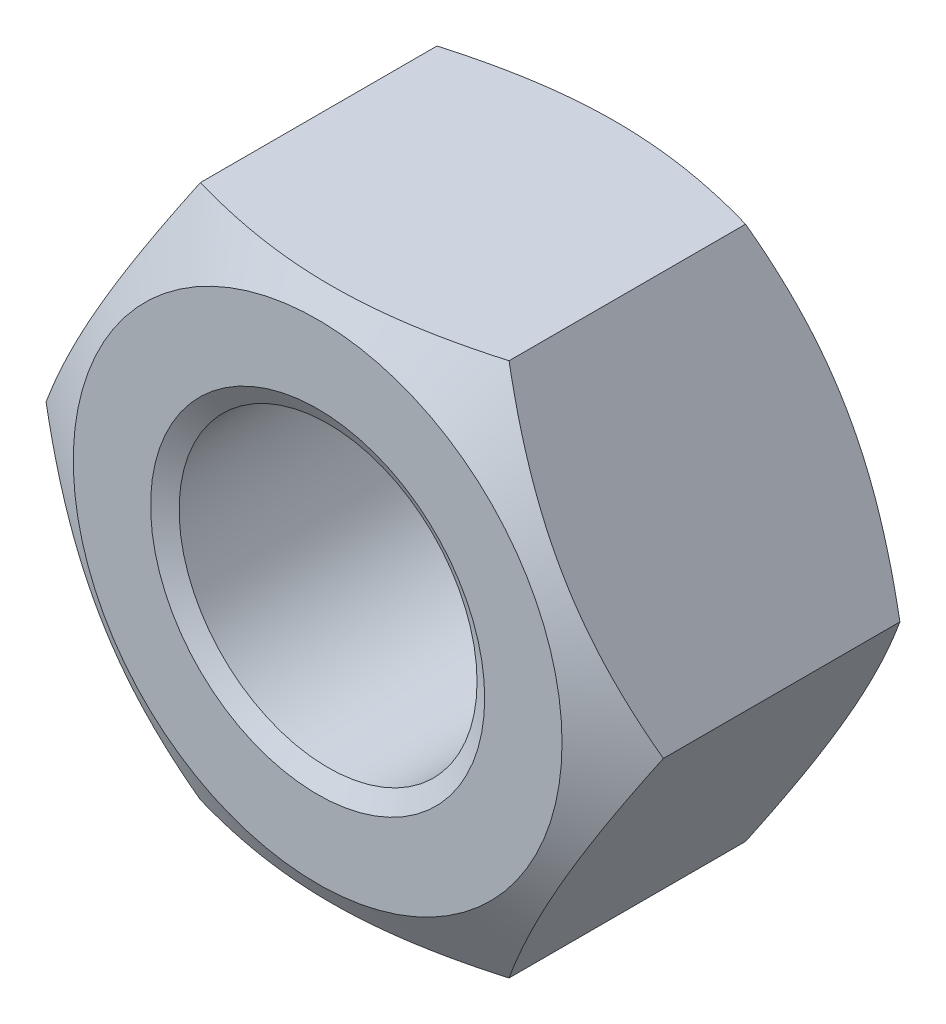
ISO-10303-21;
HEADER;
FILE_DESCRIPTION(('STEP AP214'),'2;1');
FILE_NAME('part.step','',(''),(''),'','','');
FILE_SCHEMA(('AUTOMOTIVE_DESIGN { 1 0 10303 214 1 1 1 1 }'));
ENDSEC;
DATA;
#1=APPLICATION_CONTEXT('core data for automotive mechanical design processes');
#2=APPLICATION_PROTOCOL_DEFINITION('international standard','automotive_design',2000,#1);
#3=PRODUCT_CONTEXT('',#1,'mechanical');
#4=PRODUCT('Part','Part','',(#3));
#5=PRODUCT_RELATED_PRODUCT_CATEGORY('part','',(#4));
#6=PRODUCT_DEFINITION_FORMATION('','',#4);
#7=PRODUCT_DEFINITION_CONTEXT('part definition',#1,'design');
#8=PRODUCT_DEFINITION('design','',#6,#7);
#9=PRODUCT_DEFINITION_SHAPE('','',#8);
#10=(LENGTH_UNIT() NAMED_UNIT(*) SI_UNIT(.MILLI.,.METRE.));
#11=(NAMED_UNIT(*) PLANE_ANGLE_UNIT() SI_UNIT($,.RADIAN.));
#12=(NAMED_UNIT(*) SI_UNIT($,.STERADIAN.) SOLID_ANGLE_UNIT());
#13=UNCERTAINTY_MEASURE_WITH_UNIT(LENGTH_MEASURE(1.E-05),#10,'distance_accuracy_value','');
#14=(GEOMETRIC_REPRESENTATION_CONTEXT(3) GLOBAL_UNCERTAINTY_ASSIGNED_CONTEXT((#13)) GLOBAL_UNIT_ASSIGNED_CONTEXT((#10,
#11,#12)) REPRESENTATION_CONTEXT('',''));
#15=CARTESIAN_POINT('',(0.,0.,0.));
#16=DIRECTION('',(0.,0.,1.));
#17=DIRECTION('',(1.,0.,0.));
#18=AXIS2_PLACEMENT_3D('',#15,#16,#17);
#19=CARTESIAN_POINT('',(-6.92820323027551,-4.,0.));
#20=DIRECTION('',(-0.866025403784439,-0.5,0.));
#21=DIRECTION('',(0.5,-0.866025403784439,0.));
#22=AXIS2_PLACEMENT_3D('',#19,#20,#21);
#23=PLANE('',#22);
#24=CARTESIAN_POINT('',(-9.23760430703401,0.,8.18998388578878));
#25=CARTESIAN_POINT('',(-6.92820323027554,-4.00000000000001,9.52331721912213));
#26=CARTESIAN_POINT('',(-4.61880215351701,-8.,8.18998388578878));
#27=(BOUNDED_CURVE() B_SPLINE_CURVE(2,(#24,#25,#26),.UNSPECIFIED.,.F.,
.F.) B_SPLINE_CURVE_WITH_KNOTS((3,3),(0.,9.34748910462335),
.UNSPECIFIED.) CURVE() GEOMETRIC_REPRESENTATION_ITEM() RATIONAL_B_SPLINE_CURVE((1.,
1.15470053837925,1.)) REPRESENTATION_ITEM(''));
#28=CARTESIAN_POINT('',(-9.23760430703401,0.,8.18998388578878));
#29=VERTEX_POINT('',#28);
#30=CARTESIAN_POINT('',(-4.61880215351701,-8.,8.18998388578878));
#31=VERTEX_POINT('',#30);
#32=EDGE_CURVE('E149',#29,#31,#27,.T.);
#33=ORIENTED_EDGE('',*,*,#32,.F.);
#34=DIRECTION('',(0.,0.,1.));
#35=VECTOR('',#34,1.);
#36=CARTESIAN_POINT('',(-9.23760430703401,0.,0.));
#37=LINE('',#36,#35);
#38=CARTESIAN_POINT('',(-9.23760430703401,0.,1.11001611421122));
#39=VERTEX_POINT('',#38);
#40=EDGE_CURVE('E168',#39,#29,#37,.T.);
#41=ORIENTED_EDGE('',*,*,#40,.F.);
#42=CARTESIAN_POINT('',(-4.61880215351701,-8.,1.11001611421122));
#43=CARTESIAN_POINT('',(-6.92820323027552,-4.,-0.223317219122113));
#44=CARTESIAN_POINT('',(-9.23760430703401,0.,1.11001611421122));
#45=(BOUNDED_CURVE() B_SPLINE_CURVE(2,(#42,#43,#44),.UNSPECIFIED.,.F.,
.F.) B_SPLINE_CURVE_WITH_KNOTS((3,3),(0.,9.34748910462335),
.UNSPECIFIED.) CURVE() GEOMETRIC_REPRESENTATION_ITEM() RATIONAL_B_SPLINE_CURVE((1.,
1.15470053837925,1.)) REPRESENTATION_ITEM(''));
#46=CARTESIAN_POINT('',(-4.61880215351701,-8.,1.11001611421122));
#47=VERTEX_POINT('',#46);
#48=EDGE_CURVE('E110',#47,#39,#45,.T.);
#49=ORIENTED_EDGE('',*,*,#48,.F.);
#50=DIRECTION('',(0.,0.,1.));
#51=VECTOR('',#50,1.);
#52=CARTESIAN_POINT('',(-4.61880215351701,-8.,0.));
#53=LINE('',#52,#51);
#54=EDGE_CURVE('E11',#47,#31,#53,.T.);
#55=ORIENTED_EDGE('',*,*,#54,.T.);
#56=EDGE_LOOP('',(#33,#41,#49,#55));
#57=FACE_BOUND('',#56,.T.);
#58=ADVANCED_FACE('F16',(#57),#23,.T.);
#59=CARTESIAN_POINT('',(0.,-8.,0.));
#60=DIRECTION('',(0.,-1.,0.));
#61=DIRECTION('',(1.,0.,0.));
#62=AXIS2_PLACEMENT_3D('',#59,#60,#61);
#63=PLANE('',#62);
#64=CARTESIAN_POINT('',(-4.61880215351701,-8.,8.18998388578878));
#65=CARTESIAN_POINT('',(0.,-7.99999999999999,9.52331721912211));
#66=CARTESIAN_POINT('',(4.61880215351701,-8.,8.18998388578878));
#67=(BOUNDED_CURVE() B_SPLINE_CURVE(2,(#64,#65,#66),.UNSPECIFIED.,.F.,
.F.) B_SPLINE_CURVE_WITH_KNOTS((3,3),(0.,9.34748910462335),
.UNSPECIFIED.) CURVE() GEOMETRIC_REPRESENTATION_ITEM() RATIONAL_B_SPLINE_CURVE((1.,
1.15470053837925,1.)) REPRESENTATION_ITEM(''));
#68=CARTESIAN_POINT('',(4.618802153517,-8.,8.18998388578878));
#69=VERTEX_POINT('',#68);
#70=EDGE_CURVE('E157',#31,#69,#67,.T.);
#71=ORIENTED_EDGE('',*,*,#70,.F.);
#72=ORIENTED_EDGE('',*,*,#54,.F.);
#73=CARTESIAN_POINT('',(4.61880215351701,-8.,1.11001611421122));
#74=CARTESIAN_POINT('',(0.,-8.,-0.223317219122115));
#75=CARTESIAN_POINT('',(-4.61880215351701,-8.,1.11001611421122));
#76=(BOUNDED_CURVE() B_SPLINE_CURVE(2,(#73,#74,#75),.UNSPECIFIED.,.F.,
.F.) B_SPLINE_CURVE_WITH_KNOTS((3,3),(0.,9.34748910462335),
.UNSPECIFIED.) CURVE() GEOMETRIC_REPRESENTATION_ITEM() RATIONAL_B_SPLINE_CURVE((1.,
1.15470053837925,1.)) REPRESENTATION_ITEM(''));
#77=CARTESIAN_POINT('',(4.618802153517,-8.,1.11001611421122));
#78=VERTEX_POINT('',#77);
#79=EDGE_CURVE('E105',#78,#47,#76,.T.);
#80=ORIENTED_EDGE('',*,*,#79,.F.);
#81=DIRECTION('',(0.,0.,1.));
#82=VECTOR('',#81,1.);
#83=CARTESIAN_POINT('',(4.61880215351701,-8.,0.));
#84=LINE('',#83,#82);
#85=EDGE_CURVE('E26',#78,#69,#84,.T.);
#86=ORIENTED_EDGE('',*,*,#85,.T.);
#87=EDGE_LOOP('',(#71,#72,#80,#86));
#88=FACE_BOUND('',#87,.T.);
#89=ADVANCED_FACE('F106',(#88),#63,.T.);
#90=CARTESIAN_POINT('',(0.,0.,9.3));
#91=DIRECTION('',(0.,0.,1.));
#92=DIRECTION('',(0.,-1.,0.));
#93=AXIS2_PLACEMENT_3D('',#90,#91,#92);
#94=PLANE('',#93);
#95=CARTESIAN_POINT('',(0.,0.,9.3));
#96=DIRECTION('',(0.,0.,-1.));
#97=DIRECTION('',(1.,0.,0.));
#98=AXIS2_PLACEMENT_3D('',#95,#96,#97);
#99=CIRCLE('',#98,7.315);
#100=CARTESIAN_POINT('',(7.315,0.,9.3));
#101=VERTEX_POINT('',#100);
#102=EDGE_CURVE('E33',#101,#101,#99,.T.);
#103=ORIENTED_EDGE('',*,*,#102,.F.);
#104=EDGE_LOOP('',(#103));
#105=FACE_BOUND('',#104,.T.);
#106=CARTESIAN_POINT('',(0.,0.,9.3));
#107=DIRECTION('',(0.,0.,-1.));
#108=DIRECTION('',(1.,0.,0.));
#109=AXIS2_PLACEMENT_3D('',#106,#107,#108);
#110=CIRCLE('',#109,5.);
#111=CARTESIAN_POINT('',(5.,0.,9.3));
#112=VERTEX_POINT('',#111);
#113=EDGE_CURVE('E20',#112,#112,#110,.T.);
#114=ORIENTED_EDGE('',*,*,#113,.T.);
#115=EDGE_LOOP('',(#114));
#116=FACE_BOUND('',#115,.T.);
#117=ADVANCED_FACE('F209',(#105,#116),#94,.T.);
#118=CARTESIAN_POINT('',(0.,0.,0.));
#119=DIRECTION('',(0.,0.,1.));
#120=DIRECTION('',(0.,-1.,0.));
#121=AXIS2_PLACEMENT_3D('',#118,#119,#120);
#122=PLANE('',#121);
#123=CARTESIAN_POINT('',(0.,0.,0.));
#124=DIRECTION('',(0.,0.,1.));
#125=DIRECTION('',(1.,0.,0.));
#126=AXIS2_PLACEMENT_3D('',#123,#124,#125);
#127=CIRCLE('',#126,7.315);
#128=CARTESIAN_POINT('',(7.315,0.,0.));
#129=VERTEX_POINT('',#128);
#130=EDGE_CURVE('E132',#129,#129,#127,.T.);
#131=ORIENTED_EDGE('',*,*,#130,.F.);
#132=EDGE_LOOP('',(#131));
#133=FACE_BOUND('',#132,.T.);
#134=CARTESIAN_POINT('',(0.,0.,0.));
#135=DIRECTION('',(0.,0.,1.));
#136=DIRECTION('',(1.,0.,0.));
#137=AXIS2_PLACEMENT_3D('',#134,#135,#136);
#138=CIRCLE('',#137,5.);
#139=CARTESIAN_POINT('',(5.,0.,0.));
#140=VERTEX_POINT('',#139);
#141=EDGE_CURVE('E127',#140,#140,#138,.T.);
#142=ORIENTED_EDGE('',*,*,#141,.T.);
#143=EDGE_LOOP('',(#142));
#144=FACE_BOUND('',#143,.T.);
#145=ADVANCED_FACE('F206',(#133,#144),#122,.F.);
#146=CARTESIAN_POINT('',(6.92820323027551,-4.,0.));
#147=DIRECTION('',(0.866025403784439,-0.5,0.));
#148=DIRECTION('',(0.5,0.866025403784439,0.));
#149=AXIS2_PLACEMENT_3D('',#146,#147,#148);
#150=PLANE('',#149);
#151=CARTESIAN_POINT('',(4.618802153517,-8.,8.18998388578878));
#152=CARTESIAN_POINT('',(6.92820323027549,-3.99999999999999,9.52331721912211));
#153=CARTESIAN_POINT('',(9.23760430703401,0.,8.18998388578878));
#154=(BOUNDED_CURVE() B_SPLINE_CURVE(2,(#151,#152,#153),.UNSPECIFIED.,.F.,
.F.) B_SPLINE_CURVE_WITH_KNOTS((3,3),(0.,9.34748910462335),
.UNSPECIFIED.) CURVE() GEOMETRIC_REPRESENTATION_ITEM() RATIONAL_B_SPLINE_CURVE((1.,
1.15470053837925,1.)) REPRESENTATION_ITEM(''));
#155=CARTESIAN_POINT('',(9.23760430703401,0.,8.18998388578878));
#156=VERTEX_POINT('',#155);
#157=EDGE_CURVE('E99',#69,#156,#154,.T.);
#158=ORIENTED_EDGE('',*,*,#157,.F.);
#159=ORIENTED_EDGE('',*,*,#85,.F.);
#160=CARTESIAN_POINT('',(9.23760430703401,0.,1.11001611421122));
#161=CARTESIAN_POINT('',(6.92820323027551,-4.,-0.223317219122115));
#162=CARTESIAN_POINT('',(4.618802153517,-8.,1.11001611421122));
#163=(BOUNDED_CURVE() B_SPLINE_CURVE(2,(#160,#161,#162),.UNSPECIFIED.,.F.,
.F.) B_SPLINE_CURVE_WITH_KNOTS((3,3),(0.,9.34748910462335),
.UNSPECIFIED.) CURVE() GEOMETRIC_REPRESENTATION_ITEM() RATIONAL_B_SPLINE_CURVE((1.,
1.15470053837925,1.)) REPRESENTATION_ITEM(''));
#164=CARTESIAN_POINT('',(9.23760430703401,0.,1.11001611421122));
#165=VERTEX_POINT('',#164);
#166=EDGE_CURVE('E97',#165,#78,#163,.T.);
#167=ORIENTED_EDGE('',*,*,#166,.F.);
#168=DIRECTION('',(0.,0.,1.));
#169=VECTOR('',#168,1.);
#170=CARTESIAN_POINT('',(9.23760430703401,0.,0.));
#171=LINE('',#170,#169);
#172=EDGE_CURVE('E53',#165,#156,#171,.T.);
#173=ORIENTED_EDGE('',*,*,#172,.T.);
#174=EDGE_LOOP('',(#158,#159,#167,#173));
#175=FACE_BOUND('',#174,.T.);
#176=ADVANCED_FACE('F95',(#175),#150,.T.);
#177=CARTESIAN_POINT('',(6.92820323027551,4.,0.));
#178=DIRECTION('',(0.866025403784439,0.5,0.));
#179=DIRECTION('',(-0.5,0.866025403784439,0.));
#180=AXIS2_PLACEMENT_3D('',#177,#178,#179);
#181=PLANE('',#180);
#182=CARTESIAN_POINT('',(9.23760430703401,0.,8.18998388578878));
#183=CARTESIAN_POINT('',(6.92820323027549,3.99999999999999,9.52331721912211));
#184=CARTESIAN_POINT('',(4.61880215351701,8.,8.18998388578878));
#185=(BOUNDED_CURVE() B_SPLINE_CURVE(2,(#182,#183,#184),.UNSPECIFIED.,.F.,
.F.) B_SPLINE_CURVE_WITH_KNOTS((3,3),(0.,9.34748910462335),
.UNSPECIFIED.) CURVE() GEOMETRIC_REPRESENTATION_ITEM() RATIONAL_B_SPLINE_CURVE((1.,
1.15470053837925,1.)) REPRESENTATION_ITEM(''));
#186=CARTESIAN_POINT('',(4.61880215351701,8.,8.18998388578878));
#187=VERTEX_POINT('',#186);
#188=EDGE_CURVE('E131',#156,#187,#185,.T.);
#189=ORIENTED_EDGE('',*,*,#188,.F.);
#190=ORIENTED_EDGE('',*,*,#172,.F.);
#191=CARTESIAN_POINT('',(4.61880215351701,8.,1.11001611421122));
#192=CARTESIAN_POINT('',(6.92820323027551,3.99999999999999,-0.223317219122115));
#193=CARTESIAN_POINT('',(9.23760430703401,0.,1.11001611421122));
#194=(BOUNDED_CURVE() B_SPLINE_CURVE(2,(#191,#192,#193),.UNSPECIFIED.,.F.,
.F.) B_SPLINE_CURVE_WITH_KNOTS((3,3),(0.,9.34748910462335),
.UNSPECIFIED.) CURVE() GEOMETRIC_REPRESENTATION_ITEM() RATIONAL_B_SPLINE_CURVE((1.,
1.15470053837925,1.)) REPRESENTATION_ITEM(''));
#195=CARTESIAN_POINT('',(4.61880215351701,8.,1.11001611421122));
#196=VERTEX_POINT('',#195);
#197=EDGE_CURVE('E114',#196,#165,#194,.T.);
#198=ORIENTED_EDGE('',*,*,#197,.F.);
#199=DIRECTION('',(0.,0.,1.));
#200=VECTOR('',#199,1.);
#201=CARTESIAN_POINT('',(4.61880215351701,8.,0.));
#202=LINE('',#201,#200);
#203=EDGE_CURVE('E60',#196,#187,#202,.T.);
#204=ORIENTED_EDGE('',*,*,#203,.T.);
#205=EDGE_LOOP('',(#189,#190,#198,#204));
#206=FACE_BOUND('',#205,.T.);
#207=ADVANCED_FACE('F241',(#206),#181,.T.);
#208=CARTESIAN_POINT('',(0.,8.,0.));
#209=DIRECTION('',(0.,1.,0.));
#210=DIRECTION('',(-1.,0.,0.));
#211=AXIS2_PLACEMENT_3D('',#208,#209,#210);
#212=PLANE('',#211);
#213=CARTESIAN_POINT('',(4.61880215351701,8.,8.18998388578878));
#214=CARTESIAN_POINT('',(0.,8.,9.52331721912211));
#215=CARTESIAN_POINT('',(-4.61880215351701,8.,8.18998388578878));
#216=(BOUNDED_CURVE() B_SPLINE_CURVE(2,(#213,#214,#215),.UNSPECIFIED.,.F.,
.F.) B_SPLINE_CURVE_WITH_KNOTS((3,3),(0.,9.34748910462335),
.UNSPECIFIED.) CURVE() GEOMETRIC_REPRESENTATION_ITEM() RATIONAL_B_SPLINE_CURVE((1.,
1.15470053837925,1.)) REPRESENTATION_ITEM(''));
#217=CARTESIAN_POINT('',(-4.618802153517,8.,8.18998388578878));
#218=VERTEX_POINT('',#217);
#219=EDGE_CURVE('E140',#187,#218,#216,.T.);
#220=ORIENTED_EDGE('',*,*,#219,.F.);
#221=ORIENTED_EDGE('',*,*,#203,.F.);
#222=CARTESIAN_POINT('',(-4.61880215351701,8.,1.11001611421122));
#223=CARTESIAN_POINT('',(0.,8.,-0.223317219122115));
#224=CARTESIAN_POINT('',(4.61880215351701,8.,1.11001611421122));
#225=(BOUNDED_CURVE() B_SPLINE_CURVE(2,(#222,#223,#224),.UNSPECIFIED.,.F.,
.F.) B_SPLINE_CURVE_WITH_KNOTS((3,3),(0.,9.34748910462335),
.UNSPECIFIED.) CURVE() GEOMETRIC_REPRESENTATION_ITEM() RATIONAL_B_SPLINE_CURVE((1.,
1.15470053837925,1.)) REPRESENTATION_ITEM(''));
#226=CARTESIAN_POINT('',(-4.618802153517,8.,1.11001611421122));
#227=VERTEX_POINT('',#226);
#228=EDGE_CURVE('E183',#227,#196,#225,.T.);
#229=ORIENTED_EDGE('',*,*,#228,.F.);
#230=DIRECTION('',(0.,0.,1.));
#231=VECTOR('',#230,1.);
#232=CARTESIAN_POINT('',(-4.618802153517,8.,0.));
#233=LINE('',#232,#231);
#234=EDGE_CURVE('E120',#227,#218,#233,.T.);
#235=ORIENTED_EDGE('',*,*,#234,.T.);
#236=EDGE_LOOP('',(#220,#221,#229,#235));
#237=FACE_BOUND('',#236,.T.);
#238=ADVANCED_FACE('F18',(#237),#212,.T.);
#239=CARTESIAN_POINT('',(-6.92820323027551,4.,0.));
#240=DIRECTION('',(-0.866025403784439,0.5,0.));
#241=DIRECTION('',(-0.5,-0.866025403784439,0.));
#242=AXIS2_PLACEMENT_3D('',#239,#240,#241);
#243=PLANE('',#242);
#244=CARTESIAN_POINT('',(-4.618802153517,8.,8.18998388578878));
#245=CARTESIAN_POINT('',(-6.92820323027552,4.,9.52331721912213));
#246=CARTESIAN_POINT('',(-9.23760430703401,0.,8.18998388578878));
#247=(BOUNDED_CURVE() B_SPLINE_CURVE(2,(#244,#245,#246),.UNSPECIFIED.,.F.,
.F.) B_SPLINE_CURVE_WITH_KNOTS((3,3),(0.,9.34748910462335),
.UNSPECIFIED.) CURVE() GEOMETRIC_REPRESENTATION_ITEM() RATIONAL_B_SPLINE_CURVE((1.,
1.15470053837925,1.)) REPRESENTATION_ITEM(''));
#248=EDGE_CURVE('E148',#218,#29,#247,.T.);
#249=ORIENTED_EDGE('',*,*,#248,.F.);
#250=ORIENTED_EDGE('',*,*,#234,.F.);
#251=CARTESIAN_POINT('',(-9.23760430703401,0.,1.11001611421122));
#252=CARTESIAN_POINT('',(-6.92820323027554,4.00000000000001,-0.223317219122116));
#253=CARTESIAN_POINT('',(-4.618802153517,8.,1.11001611421122));
#254=(BOUNDED_CURVE() B_SPLINE_CURVE(2,(#251,#252,#253),.UNSPECIFIED.,.F.,
.F.) B_SPLINE_CURVE_WITH_KNOTS((3,3),(0.,9.34748910462335),
.UNSPECIFIED.) CURVE() GEOMETRIC_REPRESENTATION_ITEM() RATIONAL_B_SPLINE_CURVE((1.,
1.15470053837925,1.)) REPRESENTATION_ITEM(''));
#255=EDGE_CURVE('E178',#39,#227,#254,.T.);
#256=ORIENTED_EDGE('',*,*,#255,.F.);
#257=ORIENTED_EDGE('',*,*,#40,.T.);
#258=EDGE_LOOP('',(#249,#250,#256,#257));
#259=FACE_BOUND('',#258,.T.);
#260=ADVANCED_FACE('F242',(#259),#243,.T.);
#261=CARTESIAN_POINT('',(0.,0.,8.74499194289439));
#262=DIRECTION('',(0.,0.,-1.));
#263=DIRECTION('',(1.,0.,0.));
#264=AXIS2_PLACEMENT_3D('',#261,#262,#263);
#265=CONICAL_SURFACE('',#264,8.27630215351701,1.0471975511966);
#266=ORIENTED_EDGE('',*,*,#102,.T.);
#267=EDGE_LOOP('',(#266));
#268=FACE_BOUND('',#267,.T.);
#269=ORIENTED_EDGE('',*,*,#157,.T.);
#270=ORIENTED_EDGE('',*,*,#188,.T.);
#271=ORIENTED_EDGE('',*,*,#219,.T.);
#272=ORIENTED_EDGE('',*,*,#248,.T.);
#273=ORIENTED_EDGE('',*,*,#32,.T.);
#274=ORIENTED_EDGE('',*,*,#70,.T.);
#275=EDGE_LOOP('',(#269,#270,#271,#272,#273,#274));
#276=FACE_BOUND('',#275,.T.);
#277=ADVANCED_FACE('F245',(#268,#276),#265,.T.);
#278=CARTESIAN_POINT('',(0.,0.,0.55500805710561));
#279=DIRECTION('',(0.,0.,1.));
#280=DIRECTION('',(1.,0.,0.));
#281=AXIS2_PLACEMENT_3D('',#278,#279,#280);
#282=CONICAL_SURFACE('',#281,8.27630215351701,1.0471975511966);
#283=ORIENTED_EDGE('',*,*,#130,.T.);
#284=EDGE_LOOP('',(#283));
#285=FACE_BOUND('',#284,.T.);
#286=ORIENTED_EDGE('',*,*,#166,.T.);
#287=ORIENTED_EDGE('',*,*,#79,.T.);
#288=ORIENTED_EDGE('',*,*,#48,.T.);
#289=ORIENTED_EDGE('',*,*,#255,.T.);
#290=ORIENTED_EDGE('',*,*,#228,.T.);
#291=ORIENTED_EDGE('',*,*,#197,.T.);
#292=EDGE_LOOP('',(#286,#287,#288,#289,#290,#291));
#293=FACE_BOUND('',#292,.T.);
#294=ADVANCED_FACE('F112',(#285,#293),#282,.T.);
#295=CARTESIAN_POINT('',(0.,0.,9.14375458340056));
#296=DIRECTION('',(0.,0.,1.));
#297=DIRECTION('',(1.,0.,0.));
#298=AXIS2_PLACEMENT_3D('',#295,#296,#297);
#299=CONICAL_SURFACE('',#298,4.729375,1.0471975511966);
#300=CARTESIAN_POINT('',(0.,0.,8.98750916680112));
#301=DIRECTION('',(0.,0.,1.));
#302=DIRECTION('',(1.,0.,0.));
#303=AXIS2_PLACEMENT_3D('',#300,#301,#302);
#304=CIRCLE('',#303,4.45875);
#305=CARTESIAN_POINT('',(4.45875,0.,8.98750916680112));
#306=VERTEX_POINT('',#305);
#307=EDGE_CURVE('E87',#306,#306,#304,.T.);
#308=ORIENTED_EDGE('',*,*,#307,.F.);
#309=EDGE_LOOP('',(#308));
#310=FACE_BOUND('',#309,.T.);
#311=ORIENTED_EDGE('',*,*,#113,.F.);
#312=EDGE_LOOP('',(#311));
#313=FACE_BOUND('',#312,.T.);
#314=ADVANCED_FACE('F221',(#310,#313),#299,.F.);
#315=CARTESIAN_POINT('',(0.,0.,4.65));
#316=DIRECTION('',(0.,0.,-1.));
#317=DIRECTION('',(1.,0.,0.));
#318=AXIS2_PLACEMENT_3D('',#315,#316,#317);
#319=CYLINDRICAL_SURFACE('',#318,4.45875);
#320=CARTESIAN_POINT('',(0.,0.,0.312490833198885));
#321=DIRECTION('',(0.,0.,1.));
#322=DIRECTION('',(1.,0.,0.));
#323=AXIS2_PLACEMENT_3D('',#320,#321,#322);
#324=CIRCLE('',#323,4.45875);
#325=CARTESIAN_POINT('',(4.45875,0.,0.312490833198885));
#326=VERTEX_POINT('',#325);
#327=EDGE_CURVE('E122',#326,#326,#324,.T.);
#328=ORIENTED_EDGE('',*,*,#327,.F.);
#329=EDGE_LOOP('',(#328));
#330=FACE_BOUND('',#329,.T.);
#331=ORIENTED_EDGE('',*,*,#307,.T.);
#332=EDGE_LOOP('',(#331));
#333=FACE_BOUND('',#332,.T.);
#334=ADVANCED_FACE('F216',(#330,#333),#319,.F.);
#335=CARTESIAN_POINT('',(0.,0.,0.156245416599442));
#336=DIRECTION('',(0.,0.,-1.));
#337=DIRECTION('',(1.,0.,0.));
#338=AXIS2_PLACEMENT_3D('',#335,#336,#337);
#339=CONICAL_SURFACE('',#338,4.729375,1.0471975511966);
#340=ORIENTED_EDGE('',*,*,#141,.F.);
#341=EDGE_LOOP('',(#340));
#342=FACE_BOUND('',#341,.T.);
#343=ORIENTED_EDGE('',*,*,#327,.T.);
#344=EDGE_LOOP('',(#343));
#345=FACE_BOUND('',#344,.T.);
#346=ADVANCED_FACE('F213',(#342,#345),#339,.F.);
#347=CLOSED_SHELL('',(#58,#89,#117,#145,#176,#207,#238,#260,#277,#294,#314,#334,#346));
#348=MANIFOLD_SOLID_BREP('B1',#347);
#349=ADVANCED_BREP_SHAPE_REPRESENTATION('',(#18,#348),#14);
#350=SHAPE_DEFINITION_REPRESENTATION(#9,#349);
ENDSEC;
END-ISO-10303-21;
